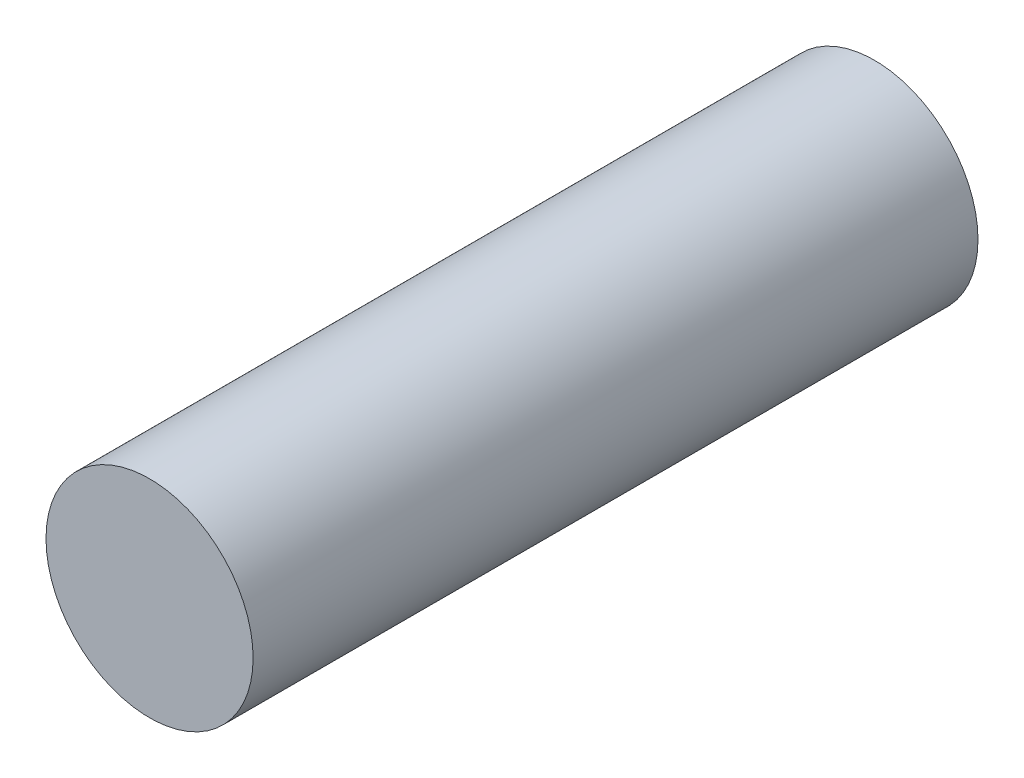
ISO-10303-21;
HEADER;
FILE_DESCRIPTION(('STEP AP214'),'2;1');
FILE_NAME('part.step','',(''),(''),'','','');
FILE_SCHEMA(('AUTOMOTIVE_DESIGN { 1 0 10303 214 1 1 1 1 }'));
ENDSEC;
DATA;
#1=APPLICATION_CONTEXT('core data for automotive mechanical design processes');
#2=APPLICATION_PROTOCOL_DEFINITION('international standard','automotive_design',2000,#1);
#3=PRODUCT_CONTEXT('',#1,'mechanical');
#4=PRODUCT('Part','Part','',(#3));
#5=PRODUCT_RELATED_PRODUCT_CATEGORY('part','',(#4));
#6=PRODUCT_DEFINITION_FORMATION('','',#4);
#7=PRODUCT_DEFINITION_CONTEXT('part definition',#1,'design');
#8=PRODUCT_DEFINITION('design','',#6,#7);
#9=PRODUCT_DEFINITION_SHAPE('','',#8);
#10=(LENGTH_UNIT() NAMED_UNIT(*) SI_UNIT(.MILLI.,.METRE.));
#11=(NAMED_UNIT(*) PLANE_ANGLE_UNIT() SI_UNIT($,.RADIAN.));
#12=(NAMED_UNIT(*) SI_UNIT($,.STERADIAN.) SOLID_ANGLE_UNIT());
#13=UNCERTAINTY_MEASURE_WITH_UNIT(LENGTH_MEASURE(1.E-05),#10,'distance_accuracy_value','');
#14=(GEOMETRIC_REPRESENTATION_CONTEXT(3) GLOBAL_UNCERTAINTY_ASSIGNED_CONTEXT((#13)) GLOBAL_UNIT_ASSIGNED_CONTEXT((#10,
#11,#12)) REPRESENTATION_CONTEXT('',''));
#15=CARTESIAN_POINT('',(0.,0.,0.));
#16=DIRECTION('',(0.,0.,1.));
#17=DIRECTION('',(1.,0.,0.));
#18=AXIS2_PLACEMENT_3D('',#15,#16,#17);
#19=CARTESIAN_POINT('',(0.,0.,70.));
#20=DIRECTION('',(0.,0.,-1.));
#21=DIRECTION('',(-1.,0.,0.));
#22=AXIS2_PLACEMENT_3D('',#19,#20,#21);
#23=CYLINDRICAL_SURFACE('',#22,10.);
#24=CARTESIAN_POINT('',(0.,0.,70.));
#25=DIRECTION('',(0.,0.,1.));
#26=DIRECTION('',(1.,0.,0.));
#27=AXIS2_PLACEMENT_3D('',#24,#25,#26);
#28=CIRCLE('',#27,10.);
#29=CARTESIAN_POINT('',(10.,0.,70.));
#30=VERTEX_POINT('',#29);
#31=EDGE_CURVE('E10',#30,#30,#28,.T.);
#32=ORIENTED_EDGE('',*,*,#31,.F.);
#33=EDGE_LOOP('',(#32));
#34=FACE_BOUND('',#33,.T.);
#35=CARTESIAN_POINT('',(0.,0.,0.));
#36=DIRECTION('',(0.,0.,1.));
#37=DIRECTION('',(1.,0.,0.));
#38=AXIS2_PLACEMENT_3D('',#35,#36,#37);
#39=CIRCLE('',#38,10.);
#40=CARTESIAN_POINT('',(10.,0.,0.));
#41=VERTEX_POINT('',#40);
#42=EDGE_CURVE('E34',#41,#41,#39,.T.);
#43=ORIENTED_EDGE('',*,*,#42,.T.);
#44=EDGE_LOOP('',(#43));
#45=FACE_BOUND('',#44,.T.);
#46=ADVANCED_FACE('F31',(#34,#45),#23,.T.);
#47=CARTESIAN_POINT('',(0.,0.,70.));
#48=DIRECTION('',(0.,0.,1.));
#49=DIRECTION('',(1.,0.,0.));
#50=AXIS2_PLACEMENT_3D('',#47,#48,#49);
#51=PLANE('',#50);
#52=ORIENTED_EDGE('',*,*,#31,.T.);
#53=EDGE_LOOP('',(#52));
#54=FACE_BOUND('',#53,.T.);
#55=ADVANCED_FACE('F46',(#54),#51,.T.);
#56=CARTESIAN_POINT('',(0.,0.,0.));
#57=DIRECTION('',(0.,0.,1.));
#58=DIRECTION('',(1.,0.,0.));
#59=AXIS2_PLACEMENT_3D('',#56,#57,#58);
#60=PLANE('',#59);
#61=ORIENTED_EDGE('',*,*,#42,.F.);
#62=EDGE_LOOP('',(#61));
#63=FACE_BOUND('',#62,.T.);
#64=ADVANCED_FACE('F44',(#63),#60,.F.);
#65=CLOSED_SHELL('',(#46,#55,#64));
#66=MANIFOLD_SOLID_BREP('B2',#65);
#67=ADVANCED_BREP_SHAPE_REPRESENTATION('',(#18,#66),#14);
#68=SHAPE_DEFINITION_REPRESENTATION(#9,#67);
ENDSEC;
END-ISO-10303-21;
